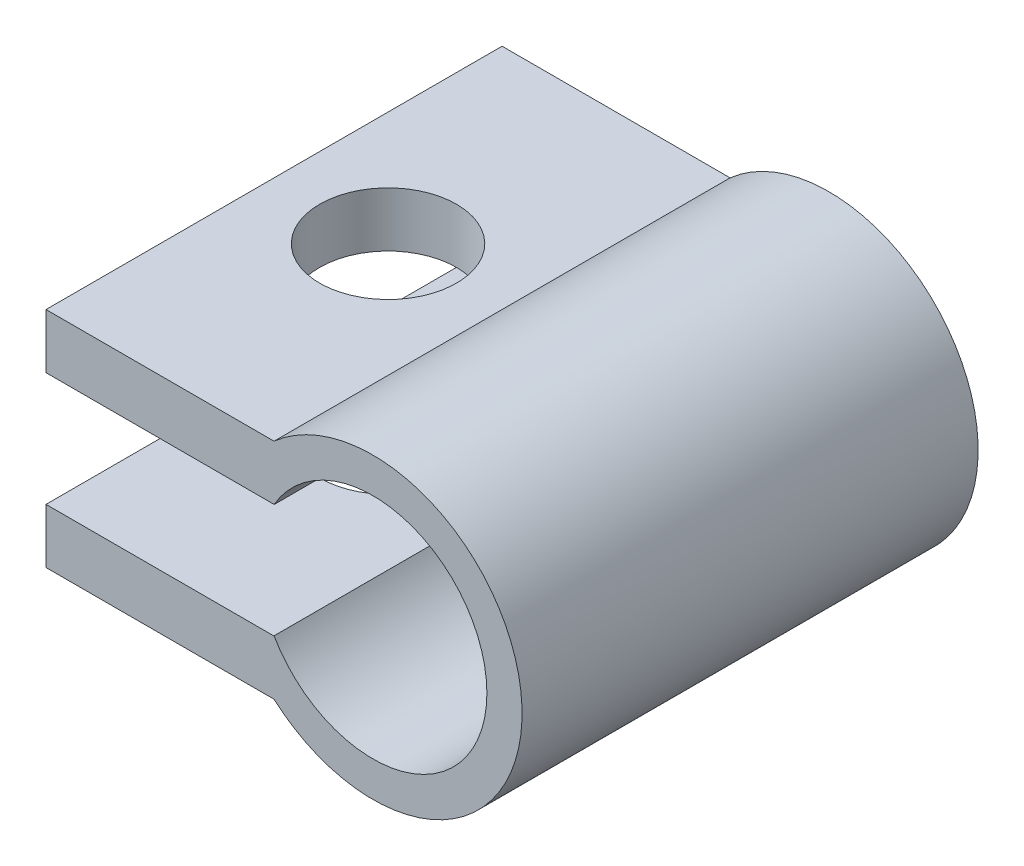
ISO-10303-21;
HEADER;
FILE_DESCRIPTION(('STEP AP214'),'2;1');
FILE_NAME('part.step','',(''),(''),'','','');
FILE_SCHEMA(('AUTOMOTIVE_DESIGN { 1 0 10303 214 1 1 1 1 }'));
ENDSEC;
DATA;
#1=APPLICATION_CONTEXT('core data for automotive mechanical design processes');
#2=APPLICATION_PROTOCOL_DEFINITION('international standard','automotive_design',2000,#1);
#3=PRODUCT_CONTEXT('',#1,'mechanical');
#4=PRODUCT('Part','Part','',(#3));
#5=PRODUCT_RELATED_PRODUCT_CATEGORY('part','',(#4));
#6=PRODUCT_DEFINITION_FORMATION('','',#4);
#7=PRODUCT_DEFINITION_CONTEXT('part definition',#1,'design');
#8=PRODUCT_DEFINITION('design','',#6,#7);
#9=PRODUCT_DEFINITION_SHAPE('','',#8);
#10=(LENGTH_UNIT() NAMED_UNIT(*) SI_UNIT(.MILLI.,.METRE.));
#11=(NAMED_UNIT(*) PLANE_ANGLE_UNIT() SI_UNIT($,.RADIAN.));
#12=(NAMED_UNIT(*) SI_UNIT($,.STERADIAN.) SOLID_ANGLE_UNIT());
#13=UNCERTAINTY_MEASURE_WITH_UNIT(LENGTH_MEASURE(1.E-05),#10,'distance_accuracy_value','');
#14=(GEOMETRIC_REPRESENTATION_CONTEXT(3) GLOBAL_UNCERTAINTY_ASSIGNED_CONTEXT((#13)) GLOBAL_UNIT_ASSIGNED_CONTEXT((#10,
#11,#12)) REPRESENTATION_CONTEXT('',''));
#15=CARTESIAN_POINT('',(0.,0.,0.));
#16=DIRECTION('',(0.,0.,1.));
#17=DIRECTION('',(1.,0.,0.));
#18=AXIS2_PLACEMENT_3D('',#15,#16,#17);
#19=CARTESIAN_POINT('',(0.,0.,5.));
#20=DIRECTION('',(0.,0.,-1.));
#21=DIRECTION('',(-1.,0.,0.));
#22=AXIS2_PLACEMENT_3D('',#19,#20,#21);
#23=CYLINDRICAL_SURFACE('',#22,2.5);
#24=CARTESIAN_POINT('',(0.,0.,-5.));
#25=DIRECTION('',(0.,0.,-1.));
#26=DIRECTION('',(-1.,0.,0.));
#27=AXIS2_PLACEMENT_3D('',#24,#25,#26);
#28=CIRCLE('',#27,2.5);
#29=CARTESIAN_POINT('',(-2.16734233575408,1.24604462185271,-5.));
#30=VERTEX_POINT('',#29);
#31=CARTESIAN_POINT('',(-2.16734233575408,-1.24604462185271,-5.));
#32=VERTEX_POINT('',#31);
#33=EDGE_CURVE('E146',#30,#32,#28,.T.);
#34=ORIENTED_EDGE('',*,*,#33,.T.);
#35=DIRECTION('',(0.,0.,-1.));
#36=VECTOR('',#35,1.);
#37=CARTESIAN_POINT('',(-2.16734233575408,-1.24604462185271,5.));
#38=LINE('',#37,#36);
#39=CARTESIAN_POINT('',(-2.16734233575408,-1.24604462185271,5.));
#40=VERTEX_POINT('',#39);
#41=EDGE_CURVE('E11',#40,#32,#38,.T.);
#42=ORIENTED_EDGE('',*,*,#41,.F.);
#43=CARTESIAN_POINT('',(0.,0.,5.));
#44=DIRECTION('',(0.,0.,-1.));
#45=DIRECTION('',(-1.,0.,0.));
#46=AXIS2_PLACEMENT_3D('',#43,#44,#45);
#47=CIRCLE('',#46,2.5);
#48=CARTESIAN_POINT('',(-2.16734233575408,1.24604462185271,5.));
#49=VERTEX_POINT('',#48);
#50=EDGE_CURVE('E165',#49,#40,#47,.T.);
#51=ORIENTED_EDGE('',*,*,#50,.F.);
#52=DIRECTION('',(0.,0.,-1.));
#53=VECTOR('',#52,1.);
#54=CARTESIAN_POINT('',(-2.16734233575408,1.24604462185271,5.));
#55=LINE('',#54,#53);
#56=EDGE_CURVE('E142',#49,#30,#55,.T.);
#57=ORIENTED_EDGE('',*,*,#56,.T.);
#58=EDGE_LOOP('',(#34,#42,#51,#57));
#59=FACE_BOUND('',#58,.T.);
#60=ADVANCED_FACE('F37',(#59),#23,.F.);
#61=CARTESIAN_POINT('',(-2.16734233575408,-1.24604462185271,5.));
#62=DIRECTION('',(1.,0.,0.));
#63=DIRECTION('',(0.,0.,-1.));
#64=AXIS2_PLACEMENT_3D('',#61,#62,#63);
#65=PLANE('',#64);
#66=DIRECTION('',(0.,-1.,0.));
#67=VECTOR('',#66,1.);
#68=CARTESIAN_POINT('',(-2.16734233575408,-1.24604462185271,-5.));
#69=LINE('',#68,#67);
#70=CARTESIAN_POINT('',(-2.16734233575408,-1.25,-5.));
#71=VERTEX_POINT('',#70);
#72=EDGE_CURVE('E149',#32,#71,#69,.T.);
#73=ORIENTED_EDGE('',*,*,#72,.T.);
#74=DIRECTION('',(0.,0.,-1.));
#75=VECTOR('',#74,1.);
#76=CARTESIAN_POINT('',(-2.16734233575408,-1.25,5.));
#77=LINE('',#76,#75);
#78=CARTESIAN_POINT('',(-2.16734233575408,-1.25,5.));
#79=VERTEX_POINT('',#78);
#80=EDGE_CURVE('E46',#79,#71,#77,.T.);
#81=ORIENTED_EDGE('',*,*,#80,.F.);
#82=DIRECTION('',(0.,-1.,0.));
#83=VECTOR('',#82,1.);
#84=CARTESIAN_POINT('',(-2.16734233575408,-1.24604462185271,5.));
#85=LINE('',#84,#83);
#86=EDGE_CURVE('E103',#40,#79,#85,.T.);
#87=ORIENTED_EDGE('',*,*,#86,.F.);
#88=ORIENTED_EDGE('',*,*,#41,.T.);
#89=EDGE_LOOP('',(#73,#81,#87,#88));
#90=FACE_BOUND('',#89,.T.);
#91=ADVANCED_FACE('F238',(#90),#65,.F.);
#92=CARTESIAN_POINT('',(-2.16734233575408,-1.25,5.));
#93=DIRECTION('',(0.,-1.,0.));
#94=DIRECTION('',(1.,0.,0.));
#95=AXIS2_PLACEMENT_3D('',#92,#93,#94);
#96=PLANE('',#95);
#97=CARTESIAN_POINT('',(-4.66734233575408,-1.25,0.));
#98=DIRECTION('',(0.,-1.,0.));
#99=DIRECTION('',(1.,0.,0.));
#100=AXIS2_PLACEMENT_3D('',#97,#98,#99);
#101=CIRCLE('',#100,1.5);
#102=CARTESIAN_POINT('',(-3.16734233575408,-1.25,0.));
#103=VERTEX_POINT('',#102);
#104=EDGE_CURVE('E150',#103,#103,#101,.T.);
#105=ORIENTED_EDGE('',*,*,#104,.T.);
#106=EDGE_LOOP('',(#105));
#107=FACE_BOUND('',#106,.T.);
#108=DIRECTION('',(-1.,0.,0.));
#109=VECTOR('',#108,1.);
#110=CARTESIAN_POINT('',(-2.16734233575408,-1.25,-5.));
#111=LINE('',#110,#109);
#112=CARTESIAN_POINT('',(-7.16734233575408,-1.25,-5.));
#113=VERTEX_POINT('',#112);
#114=EDGE_CURVE('E152',#71,#113,#111,.T.);
#115=ORIENTED_EDGE('',*,*,#114,.T.);
#116=DIRECTION('',(0.,0.,-1.));
#117=VECTOR('',#116,1.);
#118=CARTESIAN_POINT('',(-7.16734233575408,-1.25,5.));
#119=LINE('',#118,#117);
#120=CARTESIAN_POINT('',(-7.16734233575408,-1.25,5.));
#121=VERTEX_POINT('',#120);
#122=EDGE_CURVE('E178',#121,#113,#119,.T.);
#123=ORIENTED_EDGE('',*,*,#122,.F.);
#124=DIRECTION('',(-1.,0.,0.));
#125=VECTOR('',#124,1.);
#126=CARTESIAN_POINT('',(-2.16734233575408,-1.25,5.));
#127=LINE('',#126,#125);
#128=EDGE_CURVE('E187',#79,#121,#127,.T.);
#129=ORIENTED_EDGE('',*,*,#128,.F.);
#130=ORIENTED_EDGE('',*,*,#80,.T.);
#131=EDGE_LOOP('',(#115,#123,#129,#130));
#132=FACE_BOUND('',#131,.T.);
#133=ADVANCED_FACE('F185',(#107,#132),#96,.F.);
#134=CARTESIAN_POINT('',(-7.16734233575408,-1.25,5.));
#135=DIRECTION('',(1.,0.,0.));
#136=DIRECTION('',(0.,0.,-1.));
#137=AXIS2_PLACEMENT_3D('',#134,#135,#136);
#138=PLANE('',#137);
#139=DIRECTION('',(0.,-1.,0.));
#140=VECTOR('',#139,1.);
#141=CARTESIAN_POINT('',(-7.16734233575408,-1.25,-5.));
#142=LINE('',#141,#140);
#143=CARTESIAN_POINT('',(-7.16734233575408,-2.45,-5.));
#144=VERTEX_POINT('',#143);
#145=EDGE_CURVE('E154',#113,#144,#142,.T.);
#146=ORIENTED_EDGE('',*,*,#145,.T.);
#147=DIRECTION('',(0.,0.,-1.));
#148=VECTOR('',#147,1.);
#149=CARTESIAN_POINT('',(-7.16734233575408,-2.45,5.));
#150=LINE('',#149,#148);
#151=CARTESIAN_POINT('',(-7.16734233575408,-2.45,5.));
#152=VERTEX_POINT('',#151);
#153=EDGE_CURVE('E175',#152,#144,#150,.T.);
#154=ORIENTED_EDGE('',*,*,#153,.F.);
#155=DIRECTION('',(0.,-1.,0.));
#156=VECTOR('',#155,1.);
#157=CARTESIAN_POINT('',(-7.16734233575408,-1.25,5.));
#158=LINE('',#157,#156);
#159=EDGE_CURVE('E205',#121,#152,#158,.T.);
#160=ORIENTED_EDGE('',*,*,#159,.F.);
#161=ORIENTED_EDGE('',*,*,#122,.T.);
#162=EDGE_LOOP('',(#146,#154,#160,#161));
#163=FACE_BOUND('',#162,.T.);
#164=ADVANCED_FACE('F196',(#163),#138,.F.);
#165=CARTESIAN_POINT('',(-7.16734233575408,-2.45,5.));
#166=DIRECTION('',(0.,1.,0.));
#167=DIRECTION('',(0.,0.,1.));
#168=AXIS2_PLACEMENT_3D('',#165,#166,#167);
#169=PLANE('',#168);
#170=CARTESIAN_POINT('',(-4.66734233575408,-2.45,0.));
#171=DIRECTION('',(0.,1.,0.));
#172=DIRECTION('',(0.,0.,1.));
#173=AXIS2_PLACEMENT_3D('',#170,#171,#172);
#174=CIRCLE('',#173,1.5);
#175=CARTESIAN_POINT('',(-4.66734233575408,-2.45,1.5));
#176=VERTEX_POINT('',#175);
#177=EDGE_CURVE('E215',#176,#176,#174,.T.);
#178=ORIENTED_EDGE('',*,*,#177,.T.);
#179=EDGE_LOOP('',(#178));
#180=FACE_BOUND('',#179,.T.);
#181=DIRECTION('',(1.,0.,0.));
#182=VECTOR('',#181,1.);
#183=CARTESIAN_POINT('',(-7.16734233575408,-2.45,-5.));
#184=LINE('',#183,#182);
#185=CARTESIAN_POINT('',(-2.16734233575408,-2.45,-5.));
#186=VERTEX_POINT('',#185);
#187=EDGE_CURVE('E156',#144,#186,#184,.T.);
#188=ORIENTED_EDGE('',*,*,#187,.T.);
#189=DIRECTION('',(0.,0.,-1.));
#190=VECTOR('',#189,1.);
#191=CARTESIAN_POINT('',(-2.16734233575408,-2.45,5.));
#192=LINE('',#191,#190);
#193=CARTESIAN_POINT('',(-2.16734233575408,-2.45,5.));
#194=VERTEX_POINT('',#193);
#195=EDGE_CURVE('E172',#194,#186,#192,.T.);
#196=ORIENTED_EDGE('',*,*,#195,.F.);
#197=DIRECTION('',(1.,0.,0.));
#198=VECTOR('',#197,1.);
#199=CARTESIAN_POINT('',(-7.16734233575408,-2.45,5.));
#200=LINE('',#199,#198);
#201=EDGE_CURVE('E202',#152,#194,#200,.T.);
#202=ORIENTED_EDGE('',*,*,#201,.F.);
#203=ORIENTED_EDGE('',*,*,#153,.T.);
#204=EDGE_LOOP('',(#188,#196,#202,#203));
#205=FACE_BOUND('',#204,.T.);
#206=ADVANCED_FACE('F200',(#180,#205),#169,.F.);
#207=CARTESIAN_POINT('',(0.,0.,5.));
#208=DIRECTION('',(0.,0.,-1.));
#209=DIRECTION('',(-1.,0.,0.));
#210=AXIS2_PLACEMENT_3D('',#207,#208,#209);
#211=CYLINDRICAL_SURFACE('',#210,3.27106600366791);
#212=CARTESIAN_POINT('',(0.,0.,-5.));
#213=DIRECTION('',(0.,0.,1.));
#214=DIRECTION('',(-1.,0.,0.));
#215=AXIS2_PLACEMENT_3D('',#212,#213,#214);
#216=CIRCLE('',#215,3.27106600366791);
#217=CARTESIAN_POINT('',(-2.16734233575408,2.45,-5.));
#218=VERTEX_POINT('',#217);
#219=EDGE_CURVE('E158',#186,#218,#216,.T.);
#220=ORIENTED_EDGE('',*,*,#219,.T.);
#221=DIRECTION('',(0.,0.,-1.));
#222=VECTOR('',#221,1.);
#223=CARTESIAN_POINT('',(-2.16734233575408,2.45,5.));
#224=LINE('',#223,#222);
#225=CARTESIAN_POINT('',(-2.16734233575408,2.45,5.));
#226=VERTEX_POINT('',#225);
#227=EDGE_CURVE('E169',#226,#218,#224,.T.);
#228=ORIENTED_EDGE('',*,*,#227,.F.);
#229=CARTESIAN_POINT('',(0.,0.,5.));
#230=DIRECTION('',(0.,0.,1.));
#231=DIRECTION('',(-1.,0.,0.));
#232=AXIS2_PLACEMENT_3D('',#229,#230,#231);
#233=CIRCLE('',#232,3.27106600366791);
#234=EDGE_CURVE('E204',#194,#226,#233,.T.);
#235=ORIENTED_EDGE('',*,*,#234,.F.);
#236=ORIENTED_EDGE('',*,*,#195,.T.);
#237=EDGE_LOOP('',(#220,#228,#235,#236));
#238=FACE_BOUND('',#237,.T.);
#239=ADVANCED_FACE('F250',(#238),#211,.T.);
#240=CARTESIAN_POINT('',(-7.16734233575408,2.45,5.));
#241=DIRECTION('',(0.,-1.,0.));
#242=DIRECTION('',(0.,0.,-1.));
#243=AXIS2_PLACEMENT_3D('',#240,#241,#242);
#244=PLANE('',#243);
#245=CARTESIAN_POINT('',(-4.66734233575408,2.45,0.));
#246=DIRECTION('',(0.,1.,0.));
#247=DIRECTION('',(-1.,0.,0.));
#248=AXIS2_PLACEMENT_3D('',#245,#246,#247);
#249=CIRCLE('',#248,1.5);
#250=CARTESIAN_POINT('',(-6.16734233575408,2.45,0.));
#251=VERTEX_POINT('',#250);
#252=EDGE_CURVE('E218',#251,#251,#249,.T.);
#253=ORIENTED_EDGE('',*,*,#252,.F.);
#254=EDGE_LOOP('',(#253));
#255=FACE_BOUND('',#254,.T.);
#256=DIRECTION('',(-1.,0.,0.));
#257=VECTOR('',#256,1.);
#258=CARTESIAN_POINT('',(-7.16734233575408,2.45,-5.));
#259=LINE('',#258,#257);
#260=CARTESIAN_POINT('',(-7.16734233575408,2.45,-5.));
#261=VERTEX_POINT('',#260);
#262=EDGE_CURVE('E160',#218,#261,#259,.T.);
#263=ORIENTED_EDGE('',*,*,#262,.T.);
#264=DIRECTION('',(0.,0.,-1.));
#265=VECTOR('',#264,1.);
#266=CARTESIAN_POINT('',(-7.16734233575408,2.45,5.));
#267=LINE('',#266,#265);
#268=CARTESIAN_POINT('',(-7.16734233575408,2.45,5.));
#269=VERTEX_POINT('',#268);
#270=EDGE_CURVE('E137',#269,#261,#267,.T.);
#271=ORIENTED_EDGE('',*,*,#270,.F.);
#272=DIRECTION('',(-1.,0.,0.));
#273=VECTOR('',#272,1.);
#274=CARTESIAN_POINT('',(-7.16734233575408,2.45,5.));
#275=LINE('',#274,#273);
#276=EDGE_CURVE('E128',#226,#269,#275,.T.);
#277=ORIENTED_EDGE('',*,*,#276,.F.);
#278=ORIENTED_EDGE('',*,*,#227,.T.);
#279=EDGE_LOOP('',(#263,#271,#277,#278));
#280=FACE_BOUND('',#279,.T.);
#281=ADVANCED_FACE('F247',(#255,#280),#244,.F.);
#282=CARTESIAN_POINT('',(-7.16734233575408,1.25,5.));
#283=DIRECTION('',(1.,0.,0.));
#284=DIRECTION('',(0.,0.,-1.));
#285=AXIS2_PLACEMENT_3D('',#282,#283,#284);
#286=PLANE('',#285);
#287=DIRECTION('',(0.,-1.,0.));
#288=VECTOR('',#287,1.);
#289=CARTESIAN_POINT('',(-7.16734233575408,1.25,-5.));
#290=LINE('',#289,#288);
#291=CARTESIAN_POINT('',(-7.16734233575408,1.25,-5.));
#292=VERTEX_POINT('',#291);
#293=EDGE_CURVE('E136',#261,#292,#290,.T.);
#294=ORIENTED_EDGE('',*,*,#293,.T.);
#295=DIRECTION('',(0.,0.,-1.));
#296=VECTOR('',#295,1.);
#297=CARTESIAN_POINT('',(-7.16734233575408,1.25,5.));
#298=LINE('',#297,#296);
#299=CARTESIAN_POINT('',(-7.16734233575408,1.25,5.));
#300=VERTEX_POINT('',#299);
#301=EDGE_CURVE('E133',#300,#292,#298,.T.);
#302=ORIENTED_EDGE('',*,*,#301,.F.);
#303=DIRECTION('',(0.,-1.,0.));
#304=VECTOR('',#303,1.);
#305=CARTESIAN_POINT('',(-7.16734233575408,1.25,5.));
#306=LINE('',#305,#304);
#307=EDGE_CURVE('E122',#269,#300,#306,.T.);
#308=ORIENTED_EDGE('',*,*,#307,.F.);
#309=ORIENTED_EDGE('',*,*,#270,.T.);
#310=EDGE_LOOP('',(#294,#302,#308,#309));
#311=FACE_BOUND('',#310,.T.);
#312=ADVANCED_FACE('F134',(#311),#286,.F.);
#313=CARTESIAN_POINT('',(-2.16734233575408,1.25,5.));
#314=DIRECTION('',(0.,1.,0.));
#315=DIRECTION('',(-1.,0.,0.));
#316=AXIS2_PLACEMENT_3D('',#313,#314,#315);
#317=PLANE('',#316);
#318=CARTESIAN_POINT('',(-4.66734233575408,1.25,0.));
#319=DIRECTION('',(0.,1.,0.));
#320=DIRECTION('',(-1.,0.,0.));
#321=AXIS2_PLACEMENT_3D('',#318,#319,#320);
#322=CIRCLE('',#321,1.5);
#323=CARTESIAN_POINT('',(-6.16734233575408,1.25,0.));
#324=VERTEX_POINT('',#323);
#325=EDGE_CURVE('E40',#324,#324,#322,.T.);
#326=ORIENTED_EDGE('',*,*,#325,.T.);
#327=EDGE_LOOP('',(#326));
#328=FACE_BOUND('',#327,.T.);
#329=DIRECTION('',(1.,0.,0.));
#330=VECTOR('',#329,1.);
#331=CARTESIAN_POINT('',(-2.16734233575408,1.25,-5.));
#332=LINE('',#331,#330);
#333=CARTESIAN_POINT('',(-2.16734233575408,1.25,-5.));
#334=VERTEX_POINT('',#333);
#335=EDGE_CURVE('E89',#292,#334,#332,.T.);
#336=ORIENTED_EDGE('',*,*,#335,.T.);
#337=DIRECTION('',(0.,0.,-1.));
#338=VECTOR('',#337,1.);
#339=CARTESIAN_POINT('',(-2.16734233575408,1.25,5.));
#340=LINE('',#339,#338);
#341=CARTESIAN_POINT('',(-2.16734233575408,1.25,5.));
#342=VERTEX_POINT('',#341);
#343=EDGE_CURVE('E138',#342,#334,#340,.T.);
#344=ORIENTED_EDGE('',*,*,#343,.F.);
#345=DIRECTION('',(1.,0.,0.));
#346=VECTOR('',#345,1.);
#347=CARTESIAN_POINT('',(-2.16734233575408,1.25,5.));
#348=LINE('',#347,#346);
#349=EDGE_CURVE('E126',#300,#342,#348,.T.);
#350=ORIENTED_EDGE('',*,*,#349,.F.);
#351=ORIENTED_EDGE('',*,*,#301,.T.);
#352=EDGE_LOOP('',(#336,#344,#350,#351));
#353=FACE_BOUND('',#352,.T.);
#354=ADVANCED_FACE('F140',(#328,#353),#317,.F.);
#355=CARTESIAN_POINT('',(-2.16734233575408,1.24604462185271,5.));
#356=DIRECTION('',(1.,0.,0.));
#357=DIRECTION('',(0.,0.,-1.));
#358=AXIS2_PLACEMENT_3D('',#355,#356,#357);
#359=PLANE('',#358);
#360=DIRECTION('',(0.,-1.,0.));
#361=VECTOR('',#360,1.);
#362=CARTESIAN_POINT('',(-2.16734233575408,1.24604462185271,-5.));
#363=LINE('',#362,#361);
#364=EDGE_CURVE('E95',#334,#30,#363,.T.);
#365=ORIENTED_EDGE('',*,*,#364,.T.);
#366=ORIENTED_EDGE('',*,*,#56,.F.);
#367=DIRECTION('',(0.,-1.,0.));
#368=VECTOR('',#367,1.);
#369=CARTESIAN_POINT('',(-2.16734233575408,1.24604462185271,5.));
#370=LINE('',#369,#368);
#371=EDGE_CURVE('E54',#342,#49,#370,.T.);
#372=ORIENTED_EDGE('',*,*,#371,.F.);
#373=ORIENTED_EDGE('',*,*,#343,.T.);
#374=EDGE_LOOP('',(#365,#366,#372,#373));
#375=FACE_BOUND('',#374,.T.);
#376=ADVANCED_FACE('F301',(#375),#359,.F.);
#377=CARTESIAN_POINT('',(0.,0.,5.));
#378=DIRECTION('',(0.,0.,-1.));
#379=DIRECTION('',(-1.,0.,0.));
#380=AXIS2_PLACEMENT_3D('',#377,#378,#379);
#381=PLANE('',#380);
#382=ORIENTED_EDGE('',*,*,#50,.T.);
#383=ORIENTED_EDGE('',*,*,#86,.T.);
#384=ORIENTED_EDGE('',*,*,#128,.T.);
#385=ORIENTED_EDGE('',*,*,#159,.T.);
#386=ORIENTED_EDGE('',*,*,#201,.T.);
#387=ORIENTED_EDGE('',*,*,#234,.T.);
#388=ORIENTED_EDGE('',*,*,#276,.T.);
#389=ORIENTED_EDGE('',*,*,#307,.T.);
#390=ORIENTED_EDGE('',*,*,#349,.T.);
#391=ORIENTED_EDGE('',*,*,#371,.T.);
#392=EDGE_LOOP('',(#382,#383,#384,#385,#386,#387,#388,#389,#390,#391));
#393=FACE_BOUND('',#392,.T.);
#394=ADVANCED_FACE('F124',(#393),#381,.F.);
#395=CARTESIAN_POINT('',(0.,0.,-5.));
#396=DIRECTION('',(0.,0.,-1.));
#397=DIRECTION('',(-1.,0.,0.));
#398=AXIS2_PLACEMENT_3D('',#395,#396,#397);
#399=PLANE('',#398);
#400=ORIENTED_EDGE('',*,*,#33,.F.);
#401=ORIENTED_EDGE('',*,*,#364,.F.);
#402=ORIENTED_EDGE('',*,*,#335,.F.);
#403=ORIENTED_EDGE('',*,*,#293,.F.);
#404=ORIENTED_EDGE('',*,*,#262,.F.);
#405=ORIENTED_EDGE('',*,*,#219,.F.);
#406=ORIENTED_EDGE('',*,*,#187,.F.);
#407=ORIENTED_EDGE('',*,*,#145,.F.);
#408=ORIENTED_EDGE('',*,*,#114,.F.);
#409=ORIENTED_EDGE('',*,*,#72,.F.);
#410=EDGE_LOOP('',(#400,#401,#402,#403,#404,#405,#406,#407,#408,#409));
#411=FACE_BOUND('',#410,.T.);
#412=ADVANCED_FACE('F191',(#411),#399,.T.);
#413=CARTESIAN_POINT('',(-4.66734233575408,-7.55,0.));
#414=DIRECTION('',(0.,1.,0.));
#415=DIRECTION('',(-1.,0.,0.));
#416=AXIS2_PLACEMENT_3D('',#413,#414,#415);
#417=CYLINDRICAL_SURFACE('',#416,1.5);
#418=ORIENTED_EDGE('',*,*,#252,.T.);
#419=EDGE_LOOP('',(#418));
#420=FACE_BOUND('',#419,.T.);
#421=ORIENTED_EDGE('',*,*,#325,.F.);
#422=EDGE_LOOP('',(#421));
#423=FACE_BOUND('',#422,.T.);
#424=ADVANCED_FACE('F226',(#420,#423),#417,.F.);
#425=ORIENTED_EDGE('',*,*,#177,.F.);
#426=EDGE_LOOP('',(#425));
#427=FACE_BOUND('',#426,.T.);
#428=ORIENTED_EDGE('',*,*,#104,.F.);
#429=EDGE_LOOP('',(#428));
#430=FACE_BOUND('',#429,.T.);
#431=ADVANCED_FACE('F228',(#427,#430),#417,.F.);
#432=CLOSED_SHELL('',(#60,#91,#133,#164,#206,#239,#281,#312,#354,#376,#394,#412,#424,#431));
#433=MANIFOLD_SOLID_BREP('B2',#432);
#434=ADVANCED_BREP_SHAPE_REPRESENTATION('',(#18,#433),#14);
#435=SHAPE_DEFINITION_REPRESENTATION(#9,#434);
ENDSEC;
END-ISO-10303-21;
